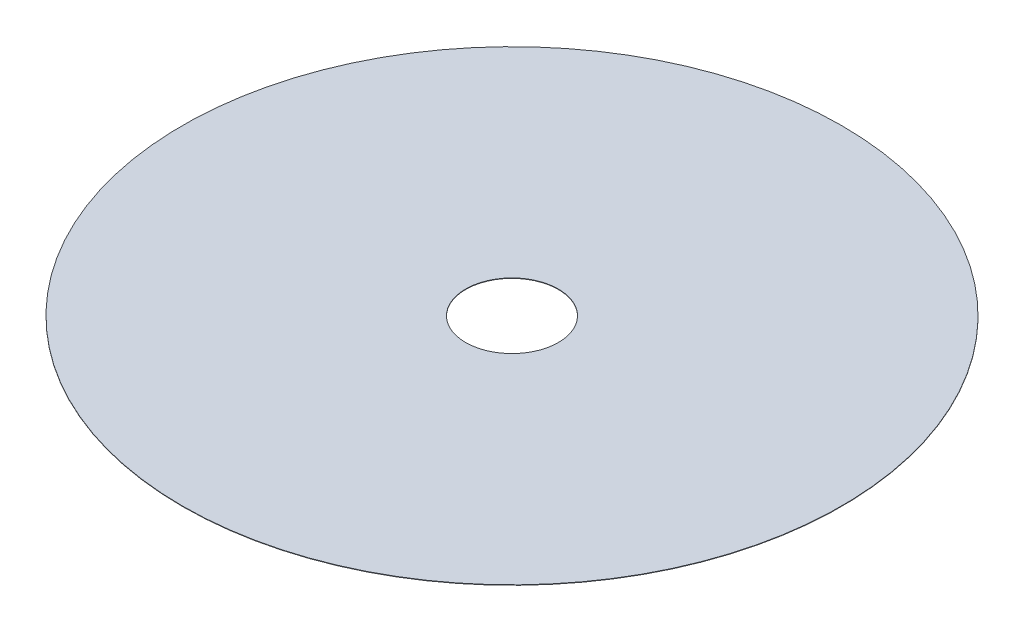
ISO-10303-21;
HEADER;
FILE_DESCRIPTION(('STEP AP214'),'2;1');
FILE_NAME('part.step','',(''),(''),'','','');
FILE_SCHEMA(('AUTOMOTIVE_DESIGN { 1 0 10303 214 1 1 1 1 }'));
ENDSEC;
DATA;
#1=APPLICATION_CONTEXT('core data for automotive mechanical design processes');
#2=APPLICATION_PROTOCOL_DEFINITION('international standard','automotive_design',2000,#1);
#3=PRODUCT_CONTEXT('',#1,'mechanical');
#4=PRODUCT('Part','Part','',(#3));
#5=PRODUCT_RELATED_PRODUCT_CATEGORY('part','',(#4));
#6=PRODUCT_DEFINITION_FORMATION('','',#4);
#7=PRODUCT_DEFINITION_CONTEXT('part definition',#1,'design');
#8=PRODUCT_DEFINITION('design','',#6,#7);
#9=PRODUCT_DEFINITION_SHAPE('','',#8);
#10=(LENGTH_UNIT() NAMED_UNIT(*) SI_UNIT(.MILLI.,.METRE.));
#11=(NAMED_UNIT(*) PLANE_ANGLE_UNIT() SI_UNIT($,.RADIAN.));
#12=(NAMED_UNIT(*) SI_UNIT($,.STERADIAN.) SOLID_ANGLE_UNIT());
#13=UNCERTAINTY_MEASURE_WITH_UNIT(LENGTH_MEASURE(1.E-05),#10,'distance_accuracy_value','');
#14=(GEOMETRIC_REPRESENTATION_CONTEXT(3) GLOBAL_UNCERTAINTY_ASSIGNED_CONTEXT((#13)) GLOBAL_UNIT_ASSIGNED_CONTEXT((#10,
#11,#12)) REPRESENTATION_CONTEXT('',''));
#15=CARTESIAN_POINT('',(0.,0.,0.));
#16=DIRECTION('',(0.,0.,1.));
#17=DIRECTION('',(1.,0.,0.));
#18=AXIS2_PLACEMENT_3D('',#15,#16,#17);
#19=CARTESIAN_POINT('',(0.,0.25,0.));
#20=DIRECTION('',(0.,1.,0.));
#21=DIRECTION('',(0.,0.,1.));
#22=AXIS2_PLACEMENT_3D('',#19,#20,#21);
#23=PLANE('',#22);
#24=CARTESIAN_POINT('',(0.,0.25,0.));
#25=DIRECTION('',(0.,1.,0.));
#26=DIRECTION('',(0.,0.,1.));
#27=AXIS2_PLACEMENT_3D('',#24,#25,#26);
#28=CIRCLE('',#27,195.5);
#29=CARTESIAN_POINT('',(0.,0.25,195.5));
#30=VERTEX_POINT('',#29);
#31=EDGE_CURVE('E10',#30,#30,#28,.T.);
#32=ORIENTED_EDGE('',*,*,#31,.T.);
#33=EDGE_LOOP('',(#32));
#34=FACE_BOUND('',#33,.T.);
#35=CARTESIAN_POINT('',(0.,0.25,0.));
#36=DIRECTION('',(0.,1.,0.));
#37=DIRECTION('',(0.,0.,1.));
#38=AXIS2_PLACEMENT_3D('',#35,#36,#37);
#39=CIRCLE('',#38,27.5);
#40=CARTESIAN_POINT('',(0.,0.25,27.5));
#41=VERTEX_POINT('',#40);
#42=EDGE_CURVE('E42',#41,#41,#39,.T.);
#43=ORIENTED_EDGE('',*,*,#42,.F.);
#44=EDGE_LOOP('',(#43));
#45=FACE_BOUND('',#44,.T.);
#46=ADVANCED_FACE('F31',(#34,#45),#23,.T.);
#47=CARTESIAN_POINT('',(0.,0.,0.));
#48=DIRECTION('',(0.,1.,0.));
#49=DIRECTION('',(0.,0.,1.));
#50=AXIS2_PLACEMENT_3D('',#47,#48,#49);
#51=PLANE('',#50);
#52=CARTESIAN_POINT('',(0.,0.,0.));
#53=DIRECTION('',(0.,1.,0.));
#54=DIRECTION('',(0.,0.,1.));
#55=AXIS2_PLACEMENT_3D('',#52,#53,#54);
#56=CIRCLE('',#55,195.5);
#57=CARTESIAN_POINT('',(0.,0.,195.5));
#58=VERTEX_POINT('',#57);
#59=EDGE_CURVE('E35',#58,#58,#56,.T.);
#60=ORIENTED_EDGE('',*,*,#59,.F.);
#61=EDGE_LOOP('',(#60));
#62=FACE_BOUND('',#61,.T.);
#63=CARTESIAN_POINT('',(0.,0.,0.));
#64=DIRECTION('',(0.,1.,0.));
#65=DIRECTION('',(0.,0.,1.));
#66=AXIS2_PLACEMENT_3D('',#63,#64,#65);
#67=CIRCLE('',#66,27.5);
#68=CARTESIAN_POINT('',(0.,0.,27.5));
#69=VERTEX_POINT('',#68);
#70=EDGE_CURVE('E44',#69,#69,#67,.T.);
#71=ORIENTED_EDGE('',*,*,#70,.T.);
#72=EDGE_LOOP('',(#71));
#73=FACE_BOUND('',#72,.T.);
#74=ADVANCED_FACE('F54',(#62,#73),#51,.F.);
#75=CARTESIAN_POINT('',(0.,0.25,0.));
#76=DIRECTION('',(0.,-1.,0.));
#77=DIRECTION('',(0.,0.,-1.));
#78=AXIS2_PLACEMENT_3D('',#75,#76,#77);
#79=CYLINDRICAL_SURFACE('',#78,195.5);
#80=ORIENTED_EDGE('',*,*,#31,.F.);
#81=EDGE_LOOP('',(#80));
#82=FACE_BOUND('',#81,.T.);
#83=ORIENTED_EDGE('',*,*,#59,.T.);
#84=EDGE_LOOP('',(#83));
#85=FACE_BOUND('',#84,.T.);
#86=ADVANCED_FACE('F33',(#82,#85),#79,.T.);
#87=CARTESIAN_POINT('',(0.,0.25,0.));
#88=DIRECTION('',(0.,-1.,0.));
#89=DIRECTION('',(0.,0.,-1.));
#90=AXIS2_PLACEMENT_3D('',#87,#88,#89);
#91=CYLINDRICAL_SURFACE('',#90,27.5);
#92=ORIENTED_EDGE('',*,*,#42,.T.);
#93=EDGE_LOOP('',(#92));
#94=FACE_BOUND('',#93,.T.);
#95=ORIENTED_EDGE('',*,*,#70,.F.);
#96=EDGE_LOOP('',(#95));
#97=FACE_BOUND('',#96,.T.);
#98=ADVANCED_FACE('F50',(#94,#97),#91,.F.);
#99=CLOSED_SHELL('',(#46,#74,#86,#98));
#100=MANIFOLD_SOLID_BREP('B2',#99);
#101=ADVANCED_BREP_SHAPE_REPRESENTATION('',(#18,#100),#14);
#102=SHAPE_DEFINITION_REPRESENTATION(#9,#101);
ENDSEC;
END-ISO-10303-21;
